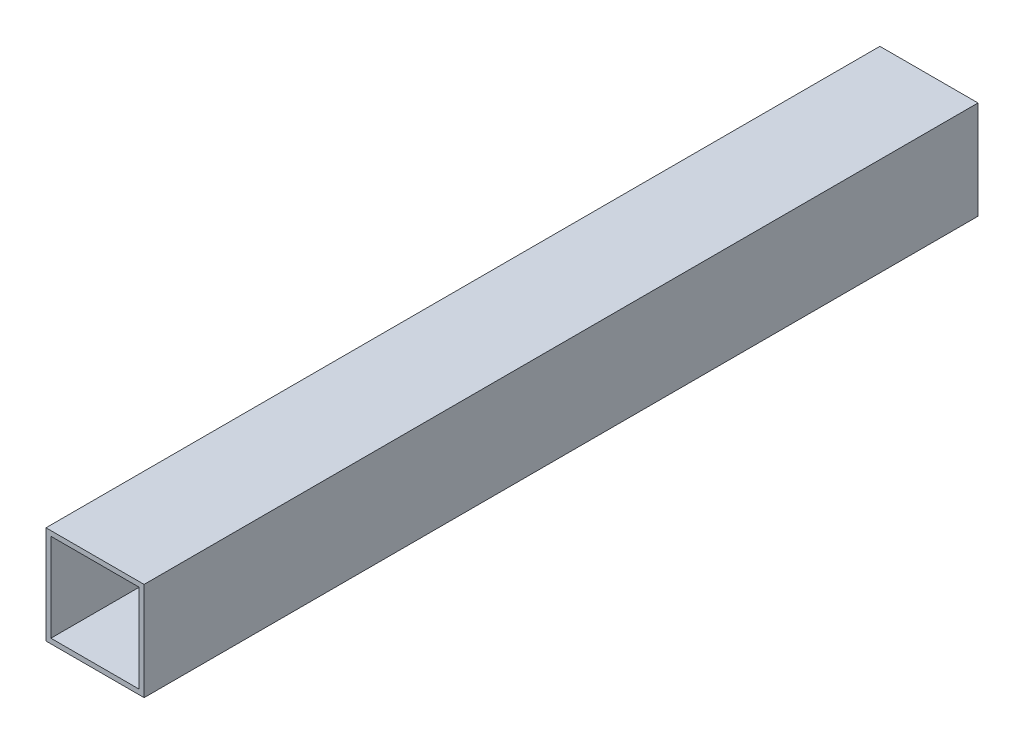
ISO-10303-21;
HEADER;
FILE_DESCRIPTION(('STEP AP214'),'2;1');
FILE_NAME('part.step','',(''),(''),'','','');
FILE_SCHEMA(('AUTOMOTIVE_DESIGN { 1 0 10303 214 1 1 1 1 }'));
ENDSEC;
DATA;
#1=APPLICATION_CONTEXT('core data for automotive mechanical design processes');
#2=APPLICATION_PROTOCOL_DEFINITION('international standard','automotive_design',2000,#1);
#3=PRODUCT_CONTEXT('',#1,'mechanical');
#4=PRODUCT('Part','Part','',(#3));
#5=PRODUCT_RELATED_PRODUCT_CATEGORY('part','',(#4));
#6=PRODUCT_DEFINITION_FORMATION('','',#4);
#7=PRODUCT_DEFINITION_CONTEXT('part definition',#1,'design');
#8=PRODUCT_DEFINITION('design','',#6,#7);
#9=PRODUCT_DEFINITION_SHAPE('','',#8);
#10=(LENGTH_UNIT() NAMED_UNIT(*) SI_UNIT(.MILLI.,.METRE.));
#11=(NAMED_UNIT(*) PLANE_ANGLE_UNIT() SI_UNIT($,.RADIAN.));
#12=(NAMED_UNIT(*) SI_UNIT($,.STERADIAN.) SOLID_ANGLE_UNIT());
#13=UNCERTAINTY_MEASURE_WITH_UNIT(LENGTH_MEASURE(1.E-05),#10,'distance_accuracy_value','');
#14=(GEOMETRIC_REPRESENTATION_CONTEXT(3) GLOBAL_UNCERTAINTY_ASSIGNED_CONTEXT((#13)) GLOBAL_UNIT_ASSIGNED_CONTEXT((#10,
#11,#12)) REPRESENTATION_CONTEXT('',''));
#15=CARTESIAN_POINT('',(0.,0.,0.));
#16=DIRECTION('',(0.,0.,1.));
#17=DIRECTION('',(1.,0.,0.));
#18=AXIS2_PLACEMENT_3D('',#15,#16,#17);
#19=CARTESIAN_POINT('',(-20.,-20.,340.));
#20=DIRECTION('',(0.,0.,1.));
#21=DIRECTION('',(1.,0.,0.));
#22=AXIS2_PLACEMENT_3D('',#19,#20,#21);
#23=PLANE('',#22);
#24=DIRECTION('',(0.,-1.,0.));
#25=VECTOR('',#24,1.);
#26=CARTESIAN_POINT('',(-20.,-20.,340.));
#27=LINE('',#26,#25);
#28=CARTESIAN_POINT('',(-20.,20.,340.));
#29=VERTEX_POINT('',#28);
#30=CARTESIAN_POINT('',(-20.,-20.,340.));
#31=VERTEX_POINT('',#30);
#32=EDGE_CURVE('E156',#29,#31,#27,.T.);
#33=ORIENTED_EDGE('',*,*,#32,.T.);
#34=DIRECTION('',(1.,0.,0.));
#35=VECTOR('',#34,1.);
#36=CARTESIAN_POINT('',(20.,-20.,340.));
#37=LINE('',#36,#35);
#38=CARTESIAN_POINT('',(20.,-20.,340.));
#39=VERTEX_POINT('',#38);
#40=EDGE_CURVE('E159',#31,#39,#37,.T.);
#41=ORIENTED_EDGE('',*,*,#40,.T.);
#42=DIRECTION('',(0.,1.,0.));
#43=VECTOR('',#42,1.);
#44=CARTESIAN_POINT('',(20.,-20.,340.));
#45=LINE('',#44,#43);
#46=CARTESIAN_POINT('',(20.,20.,340.));
#47=VERTEX_POINT('',#46);
#48=EDGE_CURVE('E162',#39,#47,#45,.T.);
#49=ORIENTED_EDGE('',*,*,#48,.T.);
#50=DIRECTION('',(-1.,0.,0.));
#51=VECTOR('',#50,1.);
#52=CARTESIAN_POINT('',(20.,20.,340.));
#53=LINE('',#52,#51);
#54=EDGE_CURVE('E164',#47,#29,#53,.T.);
#55=ORIENTED_EDGE('',*,*,#54,.T.);
#56=EDGE_LOOP('',(#33,#41,#49,#55));
#57=FACE_BOUND('',#56,.T.);
#58=DIRECTION('',(1.,0.,0.));
#59=VECTOR('',#58,1.);
#60=CARTESIAN_POINT('',(20.,-18.,340.));
#61=LINE('',#60,#59);
#62=CARTESIAN_POINT('',(-18.,-18.,340.));
#63=VERTEX_POINT('',#62);
#64=CARTESIAN_POINT('',(18.,-18.,340.));
#65=VERTEX_POINT('',#64);
#66=EDGE_CURVE('E128',#63,#65,#61,.T.);
#67=ORIENTED_EDGE('',*,*,#66,.F.);
#68=DIRECTION('',(0.,-1.,0.));
#69=VECTOR('',#68,1.);
#70=CARTESIAN_POINT('',(-18.,-20.,340.));
#71=LINE('',#70,#69);
#72=CARTESIAN_POINT('',(-18.,18.,340.));
#73=VERTEX_POINT('',#72);
#74=EDGE_CURVE('E120',#73,#63,#71,.T.);
#75=ORIENTED_EDGE('',*,*,#74,.F.);
#76=DIRECTION('',(-1.,0.,0.));
#77=VECTOR('',#76,1.);
#78=CARTESIAN_POINT('',(20.,18.,340.));
#79=LINE('',#78,#77);
#80=CARTESIAN_POINT('',(18.,18.,340.));
#81=VERTEX_POINT('',#80);
#82=EDGE_CURVE('E142',#81,#73,#79,.T.);
#83=ORIENTED_EDGE('',*,*,#82,.F.);
#84=DIRECTION('',(0.,1.,0.));
#85=VECTOR('',#84,1.);
#86=CARTESIAN_POINT('',(18.,-20.,340.));
#87=LINE('',#86,#85);
#88=EDGE_CURVE('E140',#65,#81,#87,.T.);
#89=ORIENTED_EDGE('',*,*,#88,.F.);
#90=EDGE_LOOP('',(#67,#75,#83,#89));
#91=FACE_BOUND('',#90,.T.);
#92=ADVANCED_FACE('F55',(#57,#91),#23,.T.);
#93=CARTESIAN_POINT('',(-20.,-20.,0.));
#94=DIRECTION('',(0.,0.,1.));
#95=DIRECTION('',(1.,0.,0.));
#96=AXIS2_PLACEMENT_3D('',#93,#94,#95);
#97=PLANE('',#96);
#98=DIRECTION('',(0.,-1.,0.));
#99=VECTOR('',#98,1.);
#100=CARTESIAN_POINT('',(-20.,-20.,0.));
#101=LINE('',#100,#99);
#102=CARTESIAN_POINT('',(-20.,20.,0.));
#103=VERTEX_POINT('',#102);
#104=CARTESIAN_POINT('',(-20.,-20.,0.));
#105=VERTEX_POINT('',#104);
#106=EDGE_CURVE('E136',#103,#105,#101,.T.);
#107=ORIENTED_EDGE('',*,*,#106,.F.);
#108=DIRECTION('',(-1.,0.,0.));
#109=VECTOR('',#108,1.);
#110=CARTESIAN_POINT('',(20.,20.,0.));
#111=LINE('',#110,#109);
#112=CARTESIAN_POINT('',(20.,20.,0.));
#113=VERTEX_POINT('',#112);
#114=EDGE_CURVE('E160',#113,#103,#111,.T.);
#115=ORIENTED_EDGE('',*,*,#114,.F.);
#116=DIRECTION('',(0.,1.,0.));
#117=VECTOR('',#116,1.);
#118=CARTESIAN_POINT('',(20.,-20.,0.));
#119=LINE('',#118,#117);
#120=CARTESIAN_POINT('',(20.,-20.,0.));
#121=VERTEX_POINT('',#120);
#122=EDGE_CURVE('E171',#121,#113,#119,.T.);
#123=ORIENTED_EDGE('',*,*,#122,.F.);
#124=DIRECTION('',(1.,0.,0.));
#125=VECTOR('',#124,1.);
#126=CARTESIAN_POINT('',(20.,-20.,0.));
#127=LINE('',#126,#125);
#128=EDGE_CURVE('E169',#105,#121,#127,.T.);
#129=ORIENTED_EDGE('',*,*,#128,.F.);
#130=EDGE_LOOP('',(#107,#115,#123,#129));
#131=FACE_BOUND('',#130,.T.);
#132=DIRECTION('',(0.,-1.,0.));
#133=VECTOR('',#132,1.);
#134=CARTESIAN_POINT('',(-18.,-20.,0.));
#135=LINE('',#134,#133);
#136=CARTESIAN_POINT('',(-18.,18.,0.));
#137=VERTEX_POINT('',#136);
#138=CARTESIAN_POINT('',(-18.,-18.,0.));
#139=VERTEX_POINT('',#138);
#140=EDGE_CURVE('E78',#137,#139,#135,.T.);
#141=ORIENTED_EDGE('',*,*,#140,.T.);
#142=DIRECTION('',(1.,0.,0.));
#143=VECTOR('',#142,1.);
#144=CARTESIAN_POINT('',(20.,-18.,0.));
#145=LINE('',#144,#143);
#146=CARTESIAN_POINT('',(18.,-18.,0.));
#147=VERTEX_POINT('',#146);
#148=EDGE_CURVE('E135',#139,#147,#145,.T.);
#149=ORIENTED_EDGE('',*,*,#148,.T.);
#150=DIRECTION('',(0.,1.,0.));
#151=VECTOR('',#150,1.);
#152=CARTESIAN_POINT('',(18.,-20.,0.));
#153=LINE('',#152,#151);
#154=CARTESIAN_POINT('',(18.,18.,0.));
#155=VERTEX_POINT('',#154);
#156=EDGE_CURVE('E148',#147,#155,#153,.T.);
#157=ORIENTED_EDGE('',*,*,#156,.T.);
#158=DIRECTION('',(-1.,0.,0.));
#159=VECTOR('',#158,1.);
#160=CARTESIAN_POINT('',(20.,18.,0.));
#161=LINE('',#160,#159);
#162=EDGE_CURVE('E129',#155,#137,#161,.T.);
#163=ORIENTED_EDGE('',*,*,#162,.T.);
#164=EDGE_LOOP('',(#141,#149,#157,#163));
#165=FACE_BOUND('',#164,.T.);
#166=ADVANCED_FACE('F189',(#131,#165),#97,.F.);
#167=CARTESIAN_POINT('',(-20.,-20.,340.));
#168=DIRECTION('',(1.,0.,0.));
#169=DIRECTION('',(0.,0.,-1.));
#170=AXIS2_PLACEMENT_3D('',#167,#168,#169);
#171=PLANE('',#170);
#172=ORIENTED_EDGE('',*,*,#106,.T.);
#173=DIRECTION('',(0.,0.,-1.));
#174=VECTOR('',#173,1.);
#175=CARTESIAN_POINT('',(-20.,-20.,340.));
#176=LINE('',#175,#174);
#177=EDGE_CURVE('E12',#31,#105,#176,.T.);
#178=ORIENTED_EDGE('',*,*,#177,.F.);
#179=ORIENTED_EDGE('',*,*,#32,.F.);
#180=DIRECTION('',(0.,0.,-1.));
#181=VECTOR('',#180,1.);
#182=CARTESIAN_POINT('',(-20.,20.,340.));
#183=LINE('',#182,#181);
#184=EDGE_CURVE('E166',#29,#103,#183,.T.);
#185=ORIENTED_EDGE('',*,*,#184,.T.);
#186=EDGE_LOOP('',(#172,#178,#179,#185));
#187=FACE_BOUND('',#186,.T.);
#188=ADVANCED_FACE('F57',(#187),#171,.F.);
#189=CARTESIAN_POINT('',(20.,-20.,340.));
#190=DIRECTION('',(0.,1.,0.));
#191=DIRECTION('',(-1.,0.,0.));
#192=AXIS2_PLACEMENT_3D('',#189,#190,#191);
#193=PLANE('',#192);
#194=ORIENTED_EDGE('',*,*,#128,.T.);
#195=DIRECTION('',(0.,0.,-1.));
#196=VECTOR('',#195,1.);
#197=CARTESIAN_POINT('',(20.,-20.,340.));
#198=LINE('',#197,#196);
#199=EDGE_CURVE('E63',#39,#121,#198,.T.);
#200=ORIENTED_EDGE('',*,*,#199,.F.);
#201=ORIENTED_EDGE('',*,*,#40,.F.);
#202=ORIENTED_EDGE('',*,*,#177,.T.);
#203=EDGE_LOOP('',(#194,#200,#201,#202));
#204=FACE_BOUND('',#203,.T.);
#205=ADVANCED_FACE('F199',(#204),#193,.F.);
#206=CARTESIAN_POINT('',(20.,-20.,340.));
#207=DIRECTION('',(-1.,0.,0.));
#208=DIRECTION('',(0.,0.,1.));
#209=AXIS2_PLACEMENT_3D('',#206,#207,#208);
#210=PLANE('',#209);
#211=ORIENTED_EDGE('',*,*,#122,.T.);
#212=DIRECTION('',(0.,0.,-1.));
#213=VECTOR('',#212,1.);
#214=CARTESIAN_POINT('',(20.,20.,340.));
#215=LINE('',#214,#213);
#216=EDGE_CURVE('E176',#47,#113,#215,.T.);
#217=ORIENTED_EDGE('',*,*,#216,.F.);
#218=ORIENTED_EDGE('',*,*,#48,.F.);
#219=ORIENTED_EDGE('',*,*,#199,.T.);
#220=EDGE_LOOP('',(#211,#217,#218,#219));
#221=FACE_BOUND('',#220,.T.);
#222=ADVANCED_FACE('F183',(#221),#210,.F.);
#223=CARTESIAN_POINT('',(20.,20.,340.));
#224=DIRECTION('',(0.,-1.,0.));
#225=DIRECTION('',(1.,0.,0.));
#226=AXIS2_PLACEMENT_3D('',#223,#224,#225);
#227=PLANE('',#226);
#228=ORIENTED_EDGE('',*,*,#114,.T.);
#229=ORIENTED_EDGE('',*,*,#184,.F.);
#230=ORIENTED_EDGE('',*,*,#54,.F.);
#231=ORIENTED_EDGE('',*,*,#216,.T.);
#232=EDGE_LOOP('',(#228,#229,#230,#231));
#233=FACE_BOUND('',#232,.T.);
#234=ADVANCED_FACE('F193',(#233),#227,.F.);
#235=CARTESIAN_POINT('',(-18.,-20.,340.));
#236=DIRECTION('',(1.,0.,0.));
#237=DIRECTION('',(0.,0.,-1.));
#238=AXIS2_PLACEMENT_3D('',#235,#236,#237);
#239=PLANE('',#238);
#240=ORIENTED_EDGE('',*,*,#140,.F.);
#241=DIRECTION('',(0.,0.,-1.));
#242=VECTOR('',#241,1.);
#243=CARTESIAN_POINT('',(-18.,18.,340.));
#244=LINE('',#243,#242);
#245=EDGE_CURVE('E124',#73,#137,#244,.T.);
#246=ORIENTED_EDGE('',*,*,#245,.F.);
#247=ORIENTED_EDGE('',*,*,#74,.T.);
#248=DIRECTION('',(0.,0.,-1.));
#249=VECTOR('',#248,1.);
#250=CARTESIAN_POINT('',(-18.,-18.,340.));
#251=LINE('',#250,#249);
#252=EDGE_CURVE('E123',#63,#139,#251,.T.);
#253=ORIENTED_EDGE('',*,*,#252,.T.);
#254=EDGE_LOOP('',(#240,#246,#247,#253));
#255=FACE_BOUND('',#254,.T.);
#256=ADVANCED_FACE('F122',(#255),#239,.T.);
#257=CARTESIAN_POINT('',(20.,-18.,340.));
#258=DIRECTION('',(0.,1.,0.));
#259=DIRECTION('',(-1.,0.,0.));
#260=AXIS2_PLACEMENT_3D('',#257,#258,#259);
#261=PLANE('',#260);
#262=ORIENTED_EDGE('',*,*,#148,.F.);
#263=ORIENTED_EDGE('',*,*,#252,.F.);
#264=ORIENTED_EDGE('',*,*,#66,.T.);
#265=DIRECTION('',(0.,0.,-1.));
#266=VECTOR('',#265,1.);
#267=CARTESIAN_POINT('',(18.,-18.,340.));
#268=LINE('',#267,#266);
#269=EDGE_CURVE('E137',#65,#147,#268,.T.);
#270=ORIENTED_EDGE('',*,*,#269,.T.);
#271=EDGE_LOOP('',(#262,#263,#264,#270));
#272=FACE_BOUND('',#271,.T.);
#273=ADVANCED_FACE('F132',(#272),#261,.T.);
#274=CARTESIAN_POINT('',(18.,-20.,340.));
#275=DIRECTION('',(-1.,0.,0.));
#276=DIRECTION('',(0.,0.,1.));
#277=AXIS2_PLACEMENT_3D('',#274,#275,#276);
#278=PLANE('',#277);
#279=ORIENTED_EDGE('',*,*,#156,.F.);
#280=ORIENTED_EDGE('',*,*,#269,.F.);
#281=ORIENTED_EDGE('',*,*,#88,.T.);
#282=DIRECTION('',(0.,0.,-1.));
#283=VECTOR('',#282,1.);
#284=CARTESIAN_POINT('',(18.,18.,340.));
#285=LINE('',#284,#283);
#286=EDGE_CURVE('E70',#81,#155,#285,.T.);
#287=ORIENTED_EDGE('',*,*,#286,.T.);
#288=EDGE_LOOP('',(#279,#280,#281,#287));
#289=FACE_BOUND('',#288,.T.);
#290=ADVANCED_FACE('F222',(#289),#278,.T.);
#291=CARTESIAN_POINT('',(20.,18.,340.));
#292=DIRECTION('',(0.,-1.,0.));
#293=DIRECTION('',(1.,0.,0.));
#294=AXIS2_PLACEMENT_3D('',#291,#292,#293);
#295=PLANE('',#294);
#296=ORIENTED_EDGE('',*,*,#162,.F.);
#297=ORIENTED_EDGE('',*,*,#286,.F.);
#298=ORIENTED_EDGE('',*,*,#82,.T.);
#299=ORIENTED_EDGE('',*,*,#245,.T.);
#300=EDGE_LOOP('',(#296,#297,#298,#299));
#301=FACE_BOUND('',#300,.T.);
#302=ADVANCED_FACE('F226',(#301),#295,.T.);
#303=CLOSED_SHELL('',(#92,#166,#188,#205,#222,#234,#256,#273,#290,#302));
#304=MANIFOLD_SOLID_BREP('B2',#303);
#305=ADVANCED_BREP_SHAPE_REPRESENTATION('',(#18,#304),#14);
#306=SHAPE_DEFINITION_REPRESENTATION(#9,#305);
ENDSEC;
END-ISO-10303-21;
